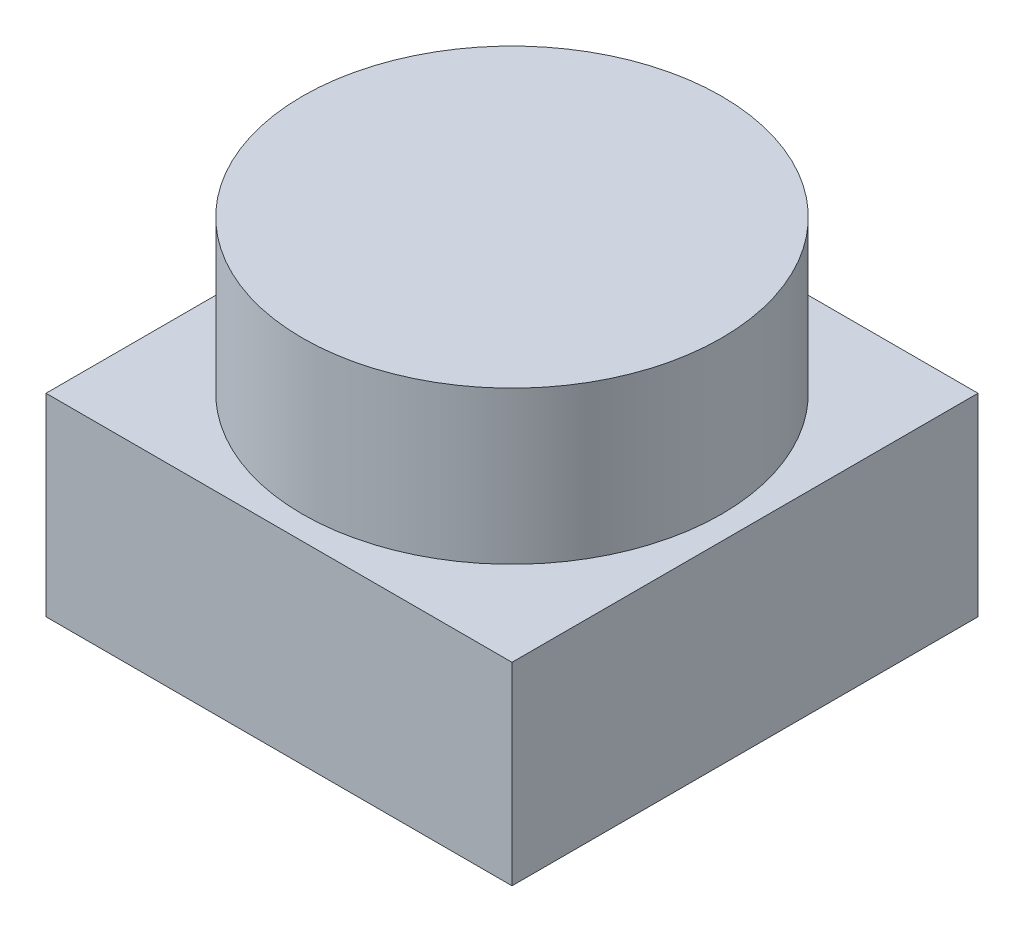
ISO-10303-21;
HEADER;
FILE_DESCRIPTION(('STEP AP214'),'2;1');
FILE_NAME('part.step','',(''),(''),'','','');
FILE_SCHEMA(('AUTOMOTIVE_DESIGN { 1 0 10303 214 1 1 1 1 }'));
ENDSEC;
DATA;
#1=APPLICATION_CONTEXT('core data for automotive mechanical design processes');
#2=APPLICATION_PROTOCOL_DEFINITION('international standard','automotive_design',2000,#1);
#3=PRODUCT_CONTEXT('',#1,'mechanical');
#4=PRODUCT('Part','Part','',(#3));
#5=PRODUCT_RELATED_PRODUCT_CATEGORY('part','',(#4));
#6=PRODUCT_DEFINITION_FORMATION('','',#4);
#7=PRODUCT_DEFINITION_CONTEXT('part definition',#1,'design');
#8=PRODUCT_DEFINITION('design','',#6,#7);
#9=PRODUCT_DEFINITION_SHAPE('','',#8);
#10=(LENGTH_UNIT() NAMED_UNIT(*) SI_UNIT(.MILLI.,.METRE.));
#11=(NAMED_UNIT(*) PLANE_ANGLE_UNIT() SI_UNIT($,.RADIAN.));
#12=(NAMED_UNIT(*) SI_UNIT($,.STERADIAN.) SOLID_ANGLE_UNIT());
#13=UNCERTAINTY_MEASURE_WITH_UNIT(LENGTH_MEASURE(1.E-05),#10,'distance_accuracy_value','');
#14=(GEOMETRIC_REPRESENTATION_CONTEXT(3) GLOBAL_UNCERTAINTY_ASSIGNED_CONTEXT((#13)) GLOBAL_UNIT_ASSIGNED_CONTEXT((#10,
#11,#12)) REPRESENTATION_CONTEXT('',''));
#15=CARTESIAN_POINT('',(0.,0.,0.));
#16=DIRECTION('',(0.,0.,1.));
#17=DIRECTION('',(1.,0.,0.));
#18=AXIS2_PLACEMENT_3D('',#15,#16,#17);
#19=CARTESIAN_POINT('',(27.8,23.1,-27.8));
#20=DIRECTION('',(-1.,0.,0.));
#21=DIRECTION('',(0.,0.,1.));
#22=AXIS2_PLACEMENT_3D('',#19,#20,#21);
#23=PLANE('',#22);
#24=DIRECTION('',(0.,0.,-1.));
#25=VECTOR('',#24,1.);
#26=CARTESIAN_POINT('',(27.8,0.,-27.8));
#27=LINE('',#26,#25);
#28=CARTESIAN_POINT('',(27.8,0.,27.8));
#29=VERTEX_POINT('',#28);
#30=CARTESIAN_POINT('',(27.8,0.,-27.8));
#31=VERTEX_POINT('',#30);
#32=EDGE_CURVE('E105',#29,#31,#27,.T.);
#33=ORIENTED_EDGE('',*,*,#32,.T.);
#34=DIRECTION('',(0.,-1.,0.));
#35=VECTOR('',#34,1.);
#36=CARTESIAN_POINT('',(27.8,23.1,-27.8));
#37=LINE('',#36,#35);
#38=CARTESIAN_POINT('',(27.8,23.1,-27.8));
#39=VERTEX_POINT('',#38);
#40=EDGE_CURVE('E42',#39,#31,#37,.T.);
#41=ORIENTED_EDGE('',*,*,#40,.F.);
#42=DIRECTION('',(0.,0.,-1.));
#43=VECTOR('',#42,1.);
#44=CARTESIAN_POINT('',(27.8,23.1,-27.8));
#45=LINE('',#44,#43);
#46=CARTESIAN_POINT('',(27.8,23.1,27.8));
#47=VERTEX_POINT('',#46);
#48=EDGE_CURVE('E92',#47,#39,#45,.T.);
#49=ORIENTED_EDGE('',*,*,#48,.F.);
#50=DIRECTION('',(0.,-1.,0.));
#51=VECTOR('',#50,1.);
#52=CARTESIAN_POINT('',(27.8,23.1,27.8));
#53=LINE('',#52,#51);
#54=EDGE_CURVE('E101',#47,#29,#53,.T.);
#55=ORIENTED_EDGE('',*,*,#54,.T.);
#56=EDGE_LOOP('',(#33,#41,#49,#55));
#57=FACE_BOUND('',#56,.T.);
#58=ADVANCED_FACE('F39',(#57),#23,.F.);
#59=CARTESIAN_POINT('',(-27.8,23.1,-27.8));
#60=DIRECTION('',(0.,0.,1.));
#61=DIRECTION('',(1.,0.,0.));
#62=AXIS2_PLACEMENT_3D('',#59,#60,#61);
#63=PLANE('',#62);
#64=DIRECTION('',(-1.,0.,0.));
#65=VECTOR('',#64,1.);
#66=CARTESIAN_POINT('',(-27.8,0.,-27.8));
#67=LINE('',#66,#65);
#68=CARTESIAN_POINT('',(-27.8,0.,-27.8));
#69=VERTEX_POINT('',#68);
#70=EDGE_CURVE('E97',#31,#69,#67,.T.);
#71=ORIENTED_EDGE('',*,*,#70,.T.);
#72=DIRECTION('',(0.,-1.,0.));
#73=VECTOR('',#72,1.);
#74=CARTESIAN_POINT('',(-27.8,23.1,-27.8));
#75=LINE('',#74,#73);
#76=CARTESIAN_POINT('',(-27.8,23.1,-27.8));
#77=VERTEX_POINT('',#76);
#78=EDGE_CURVE('E95',#77,#69,#75,.T.);
#79=ORIENTED_EDGE('',*,*,#78,.F.);
#80=DIRECTION('',(-1.,0.,0.));
#81=VECTOR('',#80,1.);
#82=CARTESIAN_POINT('',(-27.8,23.1,-27.8));
#83=LINE('',#82,#81);
#84=EDGE_CURVE('E87',#39,#77,#83,.T.);
#85=ORIENTED_EDGE('',*,*,#84,.F.);
#86=ORIENTED_EDGE('',*,*,#40,.T.);
#87=EDGE_LOOP('',(#71,#79,#85,#86));
#88=FACE_BOUND('',#87,.T.);
#89=ADVANCED_FACE('F96',(#88),#63,.F.);
#90=CARTESIAN_POINT('',(-27.8,23.1,-27.8));
#91=DIRECTION('',(1.,0.,0.));
#92=DIRECTION('',(0.,0.,-1.));
#93=AXIS2_PLACEMENT_3D('',#90,#91,#92);
#94=PLANE('',#93);
#95=DIRECTION('',(0.,0.,1.));
#96=VECTOR('',#95,1.);
#97=CARTESIAN_POINT('',(-27.8,0.,-27.8));
#98=LINE('',#97,#96);
#99=CARTESIAN_POINT('',(-27.8,0.,27.8));
#100=VERTEX_POINT('',#99);
#101=EDGE_CURVE('E73',#69,#100,#98,.T.);
#102=ORIENTED_EDGE('',*,*,#101,.T.);
#103=DIRECTION('',(0.,-1.,0.));
#104=VECTOR('',#103,1.);
#105=CARTESIAN_POINT('',(-27.8,23.1,27.8));
#106=LINE('',#105,#104);
#107=CARTESIAN_POINT('',(-27.8,23.1,27.8));
#108=VERTEX_POINT('',#107);
#109=EDGE_CURVE('E98',#108,#100,#106,.T.);
#110=ORIENTED_EDGE('',*,*,#109,.F.);
#111=DIRECTION('',(0.,0.,1.));
#112=VECTOR('',#111,1.);
#113=CARTESIAN_POINT('',(-27.8,23.1,-27.8));
#114=LINE('',#113,#112);
#115=EDGE_CURVE('E90',#77,#108,#114,.T.);
#116=ORIENTED_EDGE('',*,*,#115,.F.);
#117=ORIENTED_EDGE('',*,*,#78,.T.);
#118=EDGE_LOOP('',(#102,#110,#116,#117));
#119=FACE_BOUND('',#118,.T.);
#120=ADVANCED_FACE('F99',(#119),#94,.F.);
#121=CARTESIAN_POINT('',(-27.8,23.1,27.8));
#122=DIRECTION('',(0.,0.,-1.));
#123=DIRECTION('',(-1.,0.,0.));
#124=AXIS2_PLACEMENT_3D('',#121,#122,#123);
#125=PLANE('',#124);
#126=DIRECTION('',(1.,0.,0.));
#127=VECTOR('',#126,1.);
#128=CARTESIAN_POINT('',(-27.8,0.,27.8));
#129=LINE('',#128,#127);
#130=EDGE_CURVE('E79',#100,#29,#129,.T.);
#131=ORIENTED_EDGE('',*,*,#130,.T.);
#132=ORIENTED_EDGE('',*,*,#54,.F.);
#133=DIRECTION('',(1.,0.,0.));
#134=VECTOR('',#133,1.);
#135=CARTESIAN_POINT('',(-27.8,23.1,27.8));
#136=LINE('',#135,#134);
#137=EDGE_CURVE('E56',#108,#47,#136,.T.);
#138=ORIENTED_EDGE('',*,*,#137,.F.);
#139=ORIENTED_EDGE('',*,*,#109,.T.);
#140=EDGE_LOOP('',(#131,#132,#138,#139));
#141=FACE_BOUND('',#140,.T.);
#142=ADVANCED_FACE('F113',(#141),#125,.F.);
#143=CARTESIAN_POINT('',(0.,23.1,0.));
#144=DIRECTION('',(0.,1.,0.));
#145=DIRECTION('',(0.,0.,1.));
#146=AXIS2_PLACEMENT_3D('',#143,#144,#145);
#147=PLANE('',#146);
#148=CARTESIAN_POINT('',(0.,23.1,0.));
#149=DIRECTION('',(0.,1.,0.));
#150=DIRECTION('',(0.,0.,1.));
#151=AXIS2_PLACEMENT_3D('',#148,#149,#150);
#152=CIRCLE('',#151,25.);
#153=CARTESIAN_POINT('',(0.,23.1,25.));
#154=VERTEX_POINT('',#153);
#155=EDGE_CURVE('E11',#154,#154,#152,.T.);
#156=ORIENTED_EDGE('',*,*,#155,.F.);
#157=EDGE_LOOP('',(#156));
#158=FACE_BOUND('',#157,.T.);
#159=ORIENTED_EDGE('',*,*,#48,.T.);
#160=ORIENTED_EDGE('',*,*,#84,.T.);
#161=ORIENTED_EDGE('',*,*,#115,.T.);
#162=ORIENTED_EDGE('',*,*,#137,.T.);
#163=EDGE_LOOP('',(#159,#160,#161,#162));
#164=FACE_BOUND('',#163,.T.);
#165=ADVANCED_FACE('F88',(#158,#164),#147,.T.);
#166=CARTESIAN_POINT('',(0.,0.,0.));
#167=DIRECTION('',(0.,1.,0.));
#168=DIRECTION('',(0.,0.,1.));
#169=AXIS2_PLACEMENT_3D('',#166,#167,#168);
#170=PLANE('',#169);
#171=CARTESIAN_POINT('',(21.5,0.,21.5));
#172=DIRECTION('',(0.,-1.,0.));
#173=DIRECTION('',(0.,0.,-1.));
#174=AXIS2_PLACEMENT_3D('',#171,#172,#173);
#175=CIRCLE('',#174,1.5);
#176=CARTESIAN_POINT('',(21.5,0.,20.));
#177=VERTEX_POINT('',#176);
#178=EDGE_CURVE('E125',#177,#177,#175,.T.);
#179=ORIENTED_EDGE('',*,*,#178,.F.);
#180=EDGE_LOOP('',(#179));
#181=FACE_BOUND('',#180,.T.);
#182=CARTESIAN_POINT('',(-21.5,0.,-21.5));
#183=DIRECTION('',(0.,-1.,0.));
#184=DIRECTION('',(0.,0.,-1.));
#185=AXIS2_PLACEMENT_3D('',#182,#183,#184);
#186=CIRCLE('',#185,1.5);
#187=CARTESIAN_POINT('',(-21.5,0.,-23.));
#188=VERTEX_POINT('',#187);
#189=EDGE_CURVE('E131',#188,#188,#186,.T.);
#190=ORIENTED_EDGE('',*,*,#189,.F.);
#191=EDGE_LOOP('',(#190));
#192=FACE_BOUND('',#191,.T.);
#193=CARTESIAN_POINT('',(21.5,0.,-21.5));
#194=DIRECTION('',(0.,-1.,0.));
#195=DIRECTION('',(0.,0.,-1.));
#196=AXIS2_PLACEMENT_3D('',#193,#194,#195);
#197=CIRCLE('',#196,1.5);
#198=CARTESIAN_POINT('',(21.5,0.,-23.));
#199=VERTEX_POINT('',#198);
#200=EDGE_CURVE('E132',#199,#199,#197,.T.);
#201=ORIENTED_EDGE('',*,*,#200,.F.);
#202=EDGE_LOOP('',(#201));
#203=FACE_BOUND('',#202,.T.);
#204=CARTESIAN_POINT('',(-21.5,0.,21.5));
#205=DIRECTION('',(0.,-1.,0.));
#206=DIRECTION('',(0.,0.,-1.));
#207=AXIS2_PLACEMENT_3D('',#204,#205,#206);
#208=CIRCLE('',#207,1.5);
#209=CARTESIAN_POINT('',(-21.5,0.,20.));
#210=VERTEX_POINT('',#209);
#211=EDGE_CURVE('E122',#210,#210,#208,.T.);
#212=ORIENTED_EDGE('',*,*,#211,.F.);
#213=EDGE_LOOP('',(#212));
#214=FACE_BOUND('',#213,.T.);
#215=ORIENTED_EDGE('',*,*,#32,.F.);
#216=ORIENTED_EDGE('',*,*,#130,.F.);
#217=ORIENTED_EDGE('',*,*,#101,.F.);
#218=ORIENTED_EDGE('',*,*,#70,.F.);
#219=EDGE_LOOP('',(#215,#216,#217,#218));
#220=FACE_BOUND('',#219,.T.);
#221=ADVANCED_FACE('F116',(#181,#192,#203,#214,#220),#170,.F.);
#222=CARTESIAN_POINT('',(0.,41.3,0.));
#223=DIRECTION('',(0.,-1.,0.));
#224=DIRECTION('',(0.,0.,-1.));
#225=AXIS2_PLACEMENT_3D('',#222,#223,#224);
#226=CYLINDRICAL_SURFACE('',#225,25.);
#227=CARTESIAN_POINT('',(0.,41.3,0.));
#228=DIRECTION('',(0.,1.,0.));
#229=DIRECTION('',(0.,0.,1.));
#230=AXIS2_PLACEMENT_3D('',#227,#228,#229);
#231=CIRCLE('',#230,25.);
#232=CARTESIAN_POINT('',(0.,41.3,25.));
#233=VERTEX_POINT('',#232);
#234=EDGE_CURVE('E108',#233,#233,#231,.T.);
#235=ORIENTED_EDGE('',*,*,#234,.F.);
#236=EDGE_LOOP('',(#235));
#237=FACE_BOUND('',#236,.T.);
#238=ORIENTED_EDGE('',*,*,#155,.T.);
#239=EDGE_LOOP('',(#238));
#240=FACE_BOUND('',#239,.T.);
#241=ADVANCED_FACE('F150',(#237,#240),#226,.T.);
#242=CARTESIAN_POINT('',(0.,41.3,0.));
#243=DIRECTION('',(0.,1.,0.));
#244=DIRECTION('',(0.,0.,1.));
#245=AXIS2_PLACEMENT_3D('',#242,#243,#244);
#246=PLANE('',#245);
#247=ORIENTED_EDGE('',*,*,#234,.T.);
#248=EDGE_LOOP('',(#247));
#249=FACE_BOUND('',#248,.T.);
#250=ADVANCED_FACE('F158',(#249),#246,.T.);
#251=CARTESIAN_POINT('',(-21.5,7.,21.5));
#252=DIRECTION('',(0.,-1.,0.));
#253=DIRECTION('',(0.,0.,-1.));
#254=AXIS2_PLACEMENT_3D('',#251,#252,#253);
#255=CYLINDRICAL_SURFACE('',#254,1.5);
#256=CARTESIAN_POINT('',(-21.5,7.,21.5));
#257=DIRECTION('',(0.,-1.,0.));
#258=DIRECTION('',(0.,0.,-1.));
#259=AXIS2_PLACEMENT_3D('',#256,#257,#258);
#260=CIRCLE('',#259,1.5);
#261=CARTESIAN_POINT('',(-21.5,7.,20.));
#262=VERTEX_POINT('',#261);
#263=EDGE_CURVE('E121',#262,#262,#260,.T.);
#264=ORIENTED_EDGE('',*,*,#263,.F.);
#265=EDGE_LOOP('',(#264));
#266=FACE_BOUND('',#265,.T.);
#267=ORIENTED_EDGE('',*,*,#211,.T.);
#268=EDGE_LOOP('',(#267));
#269=FACE_BOUND('',#268,.T.);
#270=ADVANCED_FACE('F155',(#266,#269),#255,.F.);
#271=CARTESIAN_POINT('',(-21.5,7.,21.5));
#272=DIRECTION('',(0.,-1.,0.));
#273=DIRECTION('',(0.,0.,-1.));
#274=AXIS2_PLACEMENT_3D('',#271,#272,#273);
#275=PLANE('',#274);
#276=ORIENTED_EDGE('',*,*,#263,.T.);
#277=EDGE_LOOP('',(#276));
#278=FACE_BOUND('',#277,.T.);
#279=ADVANCED_FACE('F157',(#278),#275,.T.);
#280=CARTESIAN_POINT('',(21.5,7.,-21.5));
#281=DIRECTION('',(0.,-1.,0.));
#282=DIRECTION('',(0.,0.,-1.));
#283=AXIS2_PLACEMENT_3D('',#280,#281,#282);
#284=CYLINDRICAL_SURFACE('',#283,1.5);
#285=CARTESIAN_POINT('',(21.5,7.,-21.5));
#286=DIRECTION('',(0.,-1.,0.));
#287=DIRECTION('',(0.,0.,-1.));
#288=AXIS2_PLACEMENT_3D('',#285,#286,#287);
#289=CIRCLE('',#288,1.5);
#290=CARTESIAN_POINT('',(21.5,7.,-23.));
#291=VERTEX_POINT('',#290);
#292=EDGE_CURVE('E140',#291,#291,#289,.T.);
#293=ORIENTED_EDGE('',*,*,#292,.F.);
#294=EDGE_LOOP('',(#293));
#295=FACE_BOUND('',#294,.T.);
#296=ORIENTED_EDGE('',*,*,#200,.T.);
#297=EDGE_LOOP('',(#296));
#298=FACE_BOUND('',#297,.T.);
#299=ADVANCED_FACE('F146',(#295,#298),#284,.F.);
#300=CARTESIAN_POINT('',(21.5,7.,-21.5));
#301=DIRECTION('',(0.,-1.,0.));
#302=DIRECTION('',(0.,0.,-1.));
#303=AXIS2_PLACEMENT_3D('',#300,#301,#302);
#304=PLANE('',#303);
#305=ORIENTED_EDGE('',*,*,#292,.T.);
#306=EDGE_LOOP('',(#305));
#307=FACE_BOUND('',#306,.T.);
#308=ADVANCED_FACE('F247',(#307),#304,.T.);
#309=CARTESIAN_POINT('',(-21.5,7.,-21.5));
#310=DIRECTION('',(0.,-1.,0.));
#311=DIRECTION('',(0.,0.,-1.));
#312=AXIS2_PLACEMENT_3D('',#309,#310,#311);
#313=CYLINDRICAL_SURFACE('',#312,1.5);
#314=CARTESIAN_POINT('',(-21.5,7.,-21.5));
#315=DIRECTION('',(0.,-1.,0.));
#316=DIRECTION('',(0.,0.,-1.));
#317=AXIS2_PLACEMENT_3D('',#314,#315,#316);
#318=CIRCLE('',#317,1.5);
#319=CARTESIAN_POINT('',(-21.5,7.,-23.));
#320=VERTEX_POINT('',#319);
#321=EDGE_CURVE('E128',#320,#320,#318,.T.);
#322=ORIENTED_EDGE('',*,*,#321,.F.);
#323=EDGE_LOOP('',(#322));
#324=FACE_BOUND('',#323,.T.);
#325=ORIENTED_EDGE('',*,*,#189,.T.);
#326=EDGE_LOOP('',(#325));
#327=FACE_BOUND('',#326,.T.);
#328=ADVANCED_FACE('F256',(#324,#327),#313,.F.);
#329=CARTESIAN_POINT('',(-21.5,7.,-21.5));
#330=DIRECTION('',(0.,-1.,0.));
#331=DIRECTION('',(0.,0.,-1.));
#332=AXIS2_PLACEMENT_3D('',#329,#330,#331);
#333=PLANE('',#332);
#334=ORIENTED_EDGE('',*,*,#321,.T.);
#335=EDGE_LOOP('',(#334));
#336=FACE_BOUND('',#335,.T.);
#337=ADVANCED_FACE('F265',(#336),#333,.T.);
#338=CARTESIAN_POINT('',(21.5,7.,21.5));
#339=DIRECTION('',(0.,-1.,0.));
#340=DIRECTION('',(0.,0.,-1.));
#341=AXIS2_PLACEMENT_3D('',#338,#339,#340);
#342=CYLINDRICAL_SURFACE('',#341,1.5);
#343=CARTESIAN_POINT('',(21.5,7.,21.5));
#344=DIRECTION('',(0.,-1.,0.));
#345=DIRECTION('',(0.,0.,-1.));
#346=AXIS2_PLACEMENT_3D('',#343,#344,#345);
#347=CIRCLE('',#346,1.5);
#348=CARTESIAN_POINT('',(21.5,7.,20.));
#349=VERTEX_POINT('',#348);
#350=EDGE_CURVE('E135',#349,#349,#347,.T.);
#351=ORIENTED_EDGE('',*,*,#350,.F.);
#352=EDGE_LOOP('',(#351));
#353=FACE_BOUND('',#352,.T.);
#354=ORIENTED_EDGE('',*,*,#178,.T.);
#355=EDGE_LOOP('',(#354));
#356=FACE_BOUND('',#355,.T.);
#357=ADVANCED_FACE('F274',(#353,#356),#342,.F.);
#358=CARTESIAN_POINT('',(21.5,7.,21.5));
#359=DIRECTION('',(0.,-1.,0.));
#360=DIRECTION('',(0.,0.,-1.));
#361=AXIS2_PLACEMENT_3D('',#358,#359,#360);
#362=PLANE('',#361);
#363=ORIENTED_EDGE('',*,*,#350,.T.);
#364=EDGE_LOOP('',(#363));
#365=FACE_BOUND('',#364,.T.);
#366=ADVANCED_FACE('F283',(#365),#362,.T.);
#367=CLOSED_SHELL('',(#58,#89,#120,#142,#165,#221,#241,#250,#270,#279,#299,#308,#328,#337,#357,#366));
#368=MANIFOLD_SOLID_BREP('B2',#367);
#369=ADVANCED_BREP_SHAPE_REPRESENTATION('',(#18,#368),#14);
#370=SHAPE_DEFINITION_REPRESENTATION(#9,#369);
ENDSEC;
END-ISO-10303-21;
